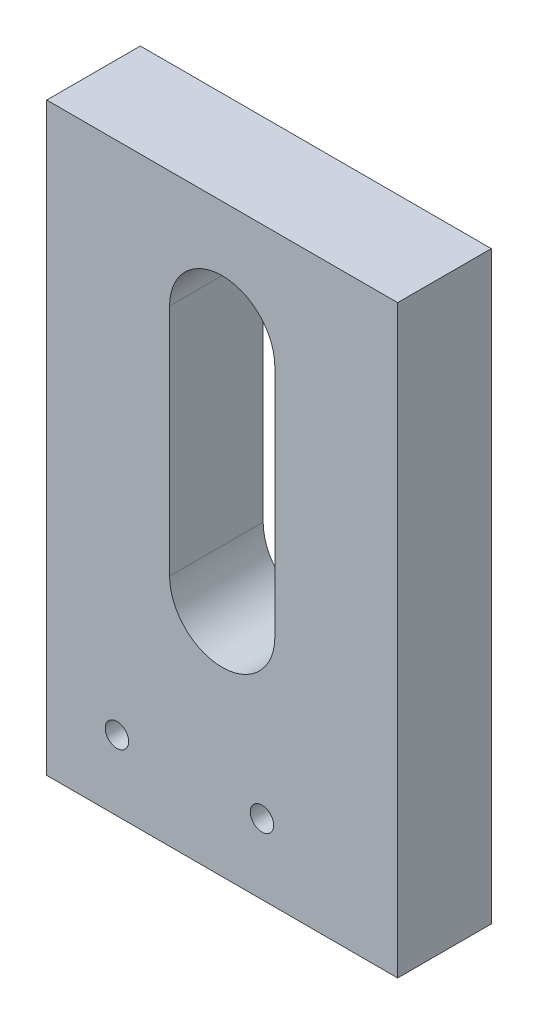
ISO-10303-21;
HEADER;
FILE_DESCRIPTION(('STEP AP214'),'2;1');
FILE_NAME('part.step','',(''),(''),'','','');
FILE_SCHEMA(('AUTOMOTIVE_DESIGN { 1 0 10303 214 1 1 1 1 }'));
ENDSEC;
DATA;
#1=APPLICATION_CONTEXT('core data for automotive mechanical design processes');
#2=APPLICATION_PROTOCOL_DEFINITION('international standard','automotive_design',2000,#1);
#3=PRODUCT_CONTEXT('',#1,'mechanical');
#4=PRODUCT('Part','Part','',(#3));
#5=PRODUCT_RELATED_PRODUCT_CATEGORY('part','',(#4));
#6=PRODUCT_DEFINITION_FORMATION('','',#4);
#7=PRODUCT_DEFINITION_CONTEXT('part definition',#1,'design');
#8=PRODUCT_DEFINITION('design','',#6,#7);
#9=PRODUCT_DEFINITION_SHAPE('','',#8);
#10=(LENGTH_UNIT() NAMED_UNIT(*) SI_UNIT(.MILLI.,.METRE.));
#11=(NAMED_UNIT(*) PLANE_ANGLE_UNIT() SI_UNIT($,.RADIAN.));
#12=(NAMED_UNIT(*) SI_UNIT($,.STERADIAN.) SOLID_ANGLE_UNIT());
#13=UNCERTAINTY_MEASURE_WITH_UNIT(LENGTH_MEASURE(1.E-05),#10,'distance_accuracy_value','');
#14=(GEOMETRIC_REPRESENTATION_CONTEXT(3) GLOBAL_UNCERTAINTY_ASSIGNED_CONTEXT((#13)) GLOBAL_UNIT_ASSIGNED_CONTEXT((#10,
#11,#12)) REPRESENTATION_CONTEXT('',''));
#15=CARTESIAN_POINT('',(0.,0.,0.));
#16=DIRECTION('',(0.,0.,1.));
#17=DIRECTION('',(1.,0.,0.));
#18=AXIS2_PLACEMENT_3D('',#15,#16,#17);
#19=CARTESIAN_POINT('',(0.,0.,4.));
#20=DIRECTION('',(0.,0.,-1.));
#21=DIRECTION('',(-1.,0.,0.));
#22=AXIS2_PLACEMENT_3D('',#19,#20,#21);
#23=PLANE('',#22);
#24=DIRECTION('',(0.,-1.,0.));
#25=VECTOR('',#24,1.);
#26=CARTESIAN_POINT('',(0.,0.,4.));
#27=LINE('',#26,#25);
#28=CARTESIAN_POINT('',(0.,25.,4.));
#29=VERTEX_POINT('',#28);
#30=CARTESIAN_POINT('',(0.,0.,4.));
#31=VERTEX_POINT('',#30);
#32=EDGE_CURVE('E137',#29,#31,#27,.T.);
#33=ORIENTED_EDGE('',*,*,#32,.T.);
#34=DIRECTION('',(1.,0.,0.));
#35=VECTOR('',#34,1.);
#36=CARTESIAN_POINT('',(0.,0.,4.));
#37=LINE('',#36,#35);
#38=CARTESIAN_POINT('',(15.,0.,4.));
#39=VERTEX_POINT('',#38);
#40=EDGE_CURVE('E140',#31,#39,#37,.T.);
#41=ORIENTED_EDGE('',*,*,#40,.T.);
#42=DIRECTION('',(0.,1.,0.));
#43=VECTOR('',#42,1.);
#44=CARTESIAN_POINT('',(15.,0.,4.));
#45=LINE('',#44,#43);
#46=CARTESIAN_POINT('',(15.,25.,4.));
#47=VERTEX_POINT('',#46);
#48=EDGE_CURVE('E143',#39,#47,#45,.T.);
#49=ORIENTED_EDGE('',*,*,#48,.T.);
#50=DIRECTION('',(-1.,0.,0.));
#51=VECTOR('',#50,1.);
#52=CARTESIAN_POINT('',(0.,25.,4.));
#53=LINE('',#52,#51);
#54=EDGE_CURVE('E145',#47,#29,#53,.T.);
#55=ORIENTED_EDGE('',*,*,#54,.T.);
#56=EDGE_LOOP('',(#33,#41,#49,#55));
#57=FACE_BOUND('',#56,.T.);
#58=CARTESIAN_POINT('',(7.5,20.,4.));
#59=DIRECTION('',(0.,0.,1.));
#60=DIRECTION('',(1.,0.,0.));
#61=AXIS2_PLACEMENT_3D('',#58,#59,#60);
#62=CIRCLE('',#61,2.25);
#63=CARTESIAN_POINT('',(9.75,20.,4.));
#64=VERTEX_POINT('',#63);
#65=CARTESIAN_POINT('',(5.25,20.,4.));
#66=VERTEX_POINT('',#65);
#67=EDGE_CURVE('E98',#64,#66,#62,.T.);
#68=ORIENTED_EDGE('',*,*,#67,.F.);
#69=DIRECTION('',(0.,1.,0.));
#70=VECTOR('',#69,1.);
#71=CARTESIAN_POINT('',(9.75,20.,4.));
#72=LINE('',#71,#70);
#73=CARTESIAN_POINT('',(9.75,10.,4.));
#74=VERTEX_POINT('',#73);
#75=EDGE_CURVE('E121',#74,#64,#72,.T.);
#76=ORIENTED_EDGE('',*,*,#75,.F.);
#77=CARTESIAN_POINT('',(7.5,10.,4.));
#78=DIRECTION('',(0.,0.,1.));
#79=DIRECTION('',(1.,0.,0.));
#80=AXIS2_PLACEMENT_3D('',#77,#78,#79);
#81=CIRCLE('',#80,2.25);
#82=CARTESIAN_POINT('',(5.25,10.,4.));
#83=VERTEX_POINT('',#82);
#84=EDGE_CURVE('E119',#83,#74,#81,.T.);
#85=ORIENTED_EDGE('',*,*,#84,.F.);
#86=DIRECTION('',(0.,-1.,0.));
#87=VECTOR('',#86,1.);
#88=CARTESIAN_POINT('',(5.25,20.,4.));
#89=LINE('',#88,#87);
#90=EDGE_CURVE('E106',#66,#83,#89,.T.);
#91=ORIENTED_EDGE('',*,*,#90,.F.);
#92=EDGE_LOOP('',(#68,#76,#85,#91));
#93=FACE_BOUND('',#92,.T.);
#94=CARTESIAN_POINT('',(3.,3.,4.));
#95=DIRECTION('',(0.,0.,1.));
#96=DIRECTION('',(1.,0.,0.));
#97=AXIS2_PLACEMENT_3D('',#94,#95,#96);
#98=CIRCLE('',#97,0.5);
#99=CARTESIAN_POINT('',(3.5,3.,4.));
#100=VERTEX_POINT('',#99);
#101=EDGE_CURVE('E127',#100,#100,#98,.T.);
#102=ORIENTED_EDGE('',*,*,#101,.F.);
#103=EDGE_LOOP('',(#102));
#104=FACE_BOUND('',#103,.T.);
#105=CARTESIAN_POINT('',(9.2,3.,4.));
#106=DIRECTION('',(0.,0.,1.));
#107=DIRECTION('',(1.,0.,0.));
#108=AXIS2_PLACEMENT_3D('',#105,#106,#107);
#109=CIRCLE('',#108,0.500000000000001);
#110=CARTESIAN_POINT('',(9.7,3.,4.));
#111=VERTEX_POINT('',#110);
#112=EDGE_CURVE('E226',#111,#111,#109,.T.);
#113=ORIENTED_EDGE('',*,*,#112,.F.);
#114=EDGE_LOOP('',(#113));
#115=FACE_BOUND('',#114,.T.);
#116=ADVANCED_FACE('F33',(#57,#93,#104,#115),#23,.F.);
#117=CARTESIAN_POINT('',(0.,0.,0.));
#118=DIRECTION('',(0.,0.,-1.));
#119=DIRECTION('',(-1.,0.,0.));
#120=AXIS2_PLACEMENT_3D('',#117,#118,#119);
#121=PLANE('',#120);
#122=CARTESIAN_POINT('',(3.,3.,0.));
#123=DIRECTION('',(0.,0.,1.));
#124=DIRECTION('',(1.,0.,0.));
#125=AXIS2_PLACEMENT_3D('',#122,#123,#124);
#126=CIRCLE('',#125,0.5);
#127=CARTESIAN_POINT('',(3.5,3.,0.));
#128=VERTEX_POINT('',#127);
#129=EDGE_CURVE('E232',#128,#128,#126,.T.);
#130=ORIENTED_EDGE('',*,*,#129,.T.);
#131=EDGE_LOOP('',(#130));
#132=FACE_BOUND('',#131,.T.);
#133=DIRECTION('',(0.,-1.,0.));
#134=VECTOR('',#133,1.);
#135=CARTESIAN_POINT('',(0.,0.,0.));
#136=LINE('',#135,#134);
#137=CARTESIAN_POINT('',(0.,25.,0.));
#138=VERTEX_POINT('',#137);
#139=CARTESIAN_POINT('',(0.,0.,0.));
#140=VERTEX_POINT('',#139);
#141=EDGE_CURVE('E114',#138,#140,#136,.T.);
#142=ORIENTED_EDGE('',*,*,#141,.F.);
#143=DIRECTION('',(-1.,0.,0.));
#144=VECTOR('',#143,1.);
#145=CARTESIAN_POINT('',(0.,25.,0.));
#146=LINE('',#145,#144);
#147=CARTESIAN_POINT('',(15.,25.,0.));
#148=VERTEX_POINT('',#147);
#149=EDGE_CURVE('E141',#148,#138,#146,.T.);
#150=ORIENTED_EDGE('',*,*,#149,.F.);
#151=DIRECTION('',(0.,1.,0.));
#152=VECTOR('',#151,1.);
#153=CARTESIAN_POINT('',(15.,0.,0.));
#154=LINE('',#153,#152);
#155=CARTESIAN_POINT('',(15.,0.,0.));
#156=VERTEX_POINT('',#155);
#157=EDGE_CURVE('E152',#156,#148,#154,.T.);
#158=ORIENTED_EDGE('',*,*,#157,.F.);
#159=DIRECTION('',(1.,0.,0.));
#160=VECTOR('',#159,1.);
#161=CARTESIAN_POINT('',(0.,0.,0.));
#162=LINE('',#161,#160);
#163=EDGE_CURVE('E150',#140,#156,#162,.T.);
#164=ORIENTED_EDGE('',*,*,#163,.F.);
#165=EDGE_LOOP('',(#142,#150,#158,#164));
#166=FACE_BOUND('',#165,.T.);
#167=DIRECTION('',(0.,1.,0.));
#168=VECTOR('',#167,1.);
#169=CARTESIAN_POINT('',(9.75,20.,0.));
#170=LINE('',#169,#168);
#171=CARTESIAN_POINT('',(9.75,10.,0.));
#172=VERTEX_POINT('',#171);
#173=CARTESIAN_POINT('',(9.75,20.,0.));
#174=VERTEX_POINT('',#173);
#175=EDGE_CURVE('E107',#172,#174,#170,.T.);
#176=ORIENTED_EDGE('',*,*,#175,.T.);
#177=CARTESIAN_POINT('',(7.5,20.,0.));
#178=DIRECTION('',(0.,0.,1.));
#179=DIRECTION('',(1.,0.,0.));
#180=AXIS2_PLACEMENT_3D('',#177,#178,#179);
#181=CIRCLE('',#180,2.25);
#182=CARTESIAN_POINT('',(5.25,20.,0.));
#183=VERTEX_POINT('',#182);
#184=EDGE_CURVE('E56',#174,#183,#181,.T.);
#185=ORIENTED_EDGE('',*,*,#184,.T.);
#186=DIRECTION('',(0.,-1.,0.));
#187=VECTOR('',#186,1.);
#188=CARTESIAN_POINT('',(5.25,20.,0.));
#189=LINE('',#188,#187);
#190=CARTESIAN_POINT('',(5.25,10.,0.));
#191=VERTEX_POINT('',#190);
#192=EDGE_CURVE('E113',#183,#191,#189,.T.);
#193=ORIENTED_EDGE('',*,*,#192,.T.);
#194=CARTESIAN_POINT('',(7.5,10.,0.));
#195=DIRECTION('',(0.,0.,1.));
#196=DIRECTION('',(1.,0.,0.));
#197=AXIS2_PLACEMENT_3D('',#194,#195,#196);
#198=CIRCLE('',#197,2.25);
#199=EDGE_CURVE('E129',#191,#172,#198,.T.);
#200=ORIENTED_EDGE('',*,*,#199,.T.);
#201=EDGE_LOOP('',(#176,#185,#193,#200));
#202=FACE_BOUND('',#201,.T.);
#203=CARTESIAN_POINT('',(9.2,3.,0.));
#204=DIRECTION('',(0.,0.,1.));
#205=DIRECTION('',(1.,0.,0.));
#206=AXIS2_PLACEMENT_3D('',#203,#204,#205);
#207=CIRCLE('',#206,0.500000000000001);
#208=CARTESIAN_POINT('',(9.7,3.,0.));
#209=VERTEX_POINT('',#208);
#210=EDGE_CURVE('E229',#209,#209,#207,.T.);
#211=ORIENTED_EDGE('',*,*,#210,.T.);
#212=EDGE_LOOP('',(#211));
#213=FACE_BOUND('',#212,.T.);
#214=ADVANCED_FACE('F170',(#132,#166,#202,#213),#121,.T.);
#215=CARTESIAN_POINT('',(0.,0.,4.));
#216=DIRECTION('',(1.,0.,0.));
#217=DIRECTION('',(0.,0.,-1.));
#218=AXIS2_PLACEMENT_3D('',#215,#216,#217);
#219=PLANE('',#218);
#220=ORIENTED_EDGE('',*,*,#141,.T.);
#221=DIRECTION('',(0.,0.,-1.));
#222=VECTOR('',#221,1.);
#223=CARTESIAN_POINT('',(0.,0.,4.));
#224=LINE('',#223,#222);
#225=EDGE_CURVE('E11',#31,#140,#224,.T.);
#226=ORIENTED_EDGE('',*,*,#225,.F.);
#227=ORIENTED_EDGE('',*,*,#32,.F.);
#228=DIRECTION('',(0.,0.,-1.));
#229=VECTOR('',#228,1.);
#230=CARTESIAN_POINT('',(0.,25.,4.));
#231=LINE('',#230,#229);
#232=EDGE_CURVE('E147',#29,#138,#231,.T.);
#233=ORIENTED_EDGE('',*,*,#232,.T.);
#234=EDGE_LOOP('',(#220,#226,#227,#233));
#235=FACE_BOUND('',#234,.T.);
#236=ADVANCED_FACE('F35',(#235),#219,.F.);
#237=CARTESIAN_POINT('',(0.,0.,4.));
#238=DIRECTION('',(0.,1.,0.));
#239=DIRECTION('',(0.,0.,1.));
#240=AXIS2_PLACEMENT_3D('',#237,#238,#239);
#241=PLANE('',#240);
#242=ORIENTED_EDGE('',*,*,#163,.T.);
#243=DIRECTION('',(0.,0.,-1.));
#244=VECTOR('',#243,1.);
#245=CARTESIAN_POINT('',(15.,0.,4.));
#246=LINE('',#245,#244);
#247=EDGE_CURVE('E41',#39,#156,#246,.T.);
#248=ORIENTED_EDGE('',*,*,#247,.F.);
#249=ORIENTED_EDGE('',*,*,#40,.F.);
#250=ORIENTED_EDGE('',*,*,#225,.T.);
#251=EDGE_LOOP('',(#242,#248,#249,#250));
#252=FACE_BOUND('',#251,.T.);
#253=ADVANCED_FACE('F180',(#252),#241,.F.);
#254=CARTESIAN_POINT('',(15.,0.,4.));
#255=DIRECTION('',(-1.,0.,0.));
#256=DIRECTION('',(0.,0.,1.));
#257=AXIS2_PLACEMENT_3D('',#254,#255,#256);
#258=PLANE('',#257);
#259=ORIENTED_EDGE('',*,*,#157,.T.);
#260=DIRECTION('',(0.,0.,-1.));
#261=VECTOR('',#260,1.);
#262=CARTESIAN_POINT('',(15.,25.,4.));
#263=LINE('',#262,#261);
#264=EDGE_CURVE('E157',#47,#148,#263,.T.);
#265=ORIENTED_EDGE('',*,*,#264,.F.);
#266=ORIENTED_EDGE('',*,*,#48,.F.);
#267=ORIENTED_EDGE('',*,*,#247,.T.);
#268=EDGE_LOOP('',(#259,#265,#266,#267));
#269=FACE_BOUND('',#268,.T.);
#270=ADVANCED_FACE('F164',(#269),#258,.F.);
#271=CARTESIAN_POINT('',(0.,25.,4.));
#272=DIRECTION('',(0.,-1.,0.));
#273=DIRECTION('',(0.,0.,-1.));
#274=AXIS2_PLACEMENT_3D('',#271,#272,#273);
#275=PLANE('',#274);
#276=ORIENTED_EDGE('',*,*,#149,.T.);
#277=ORIENTED_EDGE('',*,*,#232,.F.);
#278=ORIENTED_EDGE('',*,*,#54,.F.);
#279=ORIENTED_EDGE('',*,*,#264,.T.);
#280=EDGE_LOOP('',(#276,#277,#278,#279));
#281=FACE_BOUND('',#280,.T.);
#282=ADVANCED_FACE('F174',(#281),#275,.F.);
#283=CARTESIAN_POINT('',(7.5,20.,4.));
#284=DIRECTION('',(0.,0.,-1.));
#285=DIRECTION('',(-1.,0.,0.));
#286=AXIS2_PLACEMENT_3D('',#283,#284,#285);
#287=CYLINDRICAL_SURFACE('',#286,2.25);
#288=ORIENTED_EDGE('',*,*,#184,.F.);
#289=DIRECTION('',(0.,0.,-1.));
#290=VECTOR('',#289,1.);
#291=CARTESIAN_POINT('',(9.75,20.,4.));
#292=LINE('',#291,#290);
#293=EDGE_CURVE('E102',#64,#174,#292,.T.);
#294=ORIENTED_EDGE('',*,*,#293,.F.);
#295=ORIENTED_EDGE('',*,*,#67,.T.);
#296=DIRECTION('',(0.,0.,-1.));
#297=VECTOR('',#296,1.);
#298=CARTESIAN_POINT('',(5.25,20.,4.));
#299=LINE('',#298,#297);
#300=EDGE_CURVE('E101',#66,#183,#299,.T.);
#301=ORIENTED_EDGE('',*,*,#300,.T.);
#302=EDGE_LOOP('',(#288,#294,#295,#301));
#303=FACE_BOUND('',#302,.T.);
#304=ADVANCED_FACE('F100',(#303),#287,.F.);
#305=CARTESIAN_POINT('',(5.25,20.,4.));
#306=DIRECTION('',(1.,0.,0.));
#307=DIRECTION('',(0.,1.,0.));
#308=AXIS2_PLACEMENT_3D('',#305,#306,#307);
#309=PLANE('',#308);
#310=ORIENTED_EDGE('',*,*,#192,.F.);
#311=ORIENTED_EDGE('',*,*,#300,.F.);
#312=ORIENTED_EDGE('',*,*,#90,.T.);
#313=DIRECTION('',(0.,0.,-1.));
#314=VECTOR('',#313,1.);
#315=CARTESIAN_POINT('',(5.25,10.,4.));
#316=LINE('',#315,#314);
#317=EDGE_CURVE('E115',#83,#191,#316,.T.);
#318=ORIENTED_EDGE('',*,*,#317,.T.);
#319=EDGE_LOOP('',(#310,#311,#312,#318));
#320=FACE_BOUND('',#319,.T.);
#321=ADVANCED_FACE('F110',(#320),#309,.T.);
#322=CARTESIAN_POINT('',(7.5,10.,4.));
#323=DIRECTION('',(0.,0.,-1.));
#324=DIRECTION('',(-1.,0.,0.));
#325=AXIS2_PLACEMENT_3D('',#322,#323,#324);
#326=CYLINDRICAL_SURFACE('',#325,2.25);
#327=ORIENTED_EDGE('',*,*,#199,.F.);
#328=ORIENTED_EDGE('',*,*,#317,.F.);
#329=ORIENTED_EDGE('',*,*,#84,.T.);
#330=DIRECTION('',(0.,0.,-1.));
#331=VECTOR('',#330,1.);
#332=CARTESIAN_POINT('',(9.75,10.,4.));
#333=LINE('',#332,#331);
#334=EDGE_CURVE('E48',#74,#172,#333,.T.);
#335=ORIENTED_EDGE('',*,*,#334,.T.);
#336=EDGE_LOOP('',(#327,#328,#329,#335));
#337=FACE_BOUND('',#336,.T.);
#338=ADVANCED_FACE('F204',(#337),#326,.F.);
#339=CARTESIAN_POINT('',(9.75,20.,4.));
#340=DIRECTION('',(-1.,0.,0.));
#341=DIRECTION('',(0.,0.,1.));
#342=AXIS2_PLACEMENT_3D('',#339,#340,#341);
#343=PLANE('',#342);
#344=ORIENTED_EDGE('',*,*,#175,.F.);
#345=ORIENTED_EDGE('',*,*,#334,.F.);
#346=ORIENTED_EDGE('',*,*,#75,.T.);
#347=ORIENTED_EDGE('',*,*,#293,.T.);
#348=EDGE_LOOP('',(#344,#345,#346,#347));
#349=FACE_BOUND('',#348,.T.);
#350=ADVANCED_FACE('F208',(#349),#343,.T.);
#351=CARTESIAN_POINT('',(3.,3.,4.));
#352=DIRECTION('',(0.,0.,-1.));
#353=DIRECTION('',(-1.,0.,0.));
#354=AXIS2_PLACEMENT_3D('',#351,#352,#353);
#355=CYLINDRICAL_SURFACE('',#354,0.5);
#356=ORIENTED_EDGE('',*,*,#101,.T.);
#357=EDGE_LOOP('',(#356));
#358=FACE_BOUND('',#357,.T.);
#359=ORIENTED_EDGE('',*,*,#129,.F.);
#360=EDGE_LOOP('',(#359));
#361=FACE_BOUND('',#360,.T.);
#362=ADVANCED_FACE('F214',(#358,#361),#355,.F.);
#363=CARTESIAN_POINT('',(9.2,3.,4.));
#364=DIRECTION('',(0.,0.,-1.));
#365=DIRECTION('',(-1.,0.,0.));
#366=AXIS2_PLACEMENT_3D('',#363,#364,#365);
#367=CYLINDRICAL_SURFACE('',#366,0.500000000000001);
#368=ORIENTED_EDGE('',*,*,#112,.T.);
#369=EDGE_LOOP('',(#368));
#370=FACE_BOUND('',#369,.T.);
#371=ORIENTED_EDGE('',*,*,#210,.F.);
#372=EDGE_LOOP('',(#371));
#373=FACE_BOUND('',#372,.T.);
#374=ADVANCED_FACE('F217',(#370,#373),#367,.F.);
#375=CLOSED_SHELL('',(#116,#214,#236,#253,#270,#282,#304,#321,#338,#350,#362,#374));
#376=MANIFOLD_SOLID_BREP('B2',#375);
#377=ADVANCED_BREP_SHAPE_REPRESENTATION('',(#18,#376),#14);
#378=SHAPE_DEFINITION_REPRESENTATION(#9,#377);
ENDSEC;
END-ISO-10303-21;
